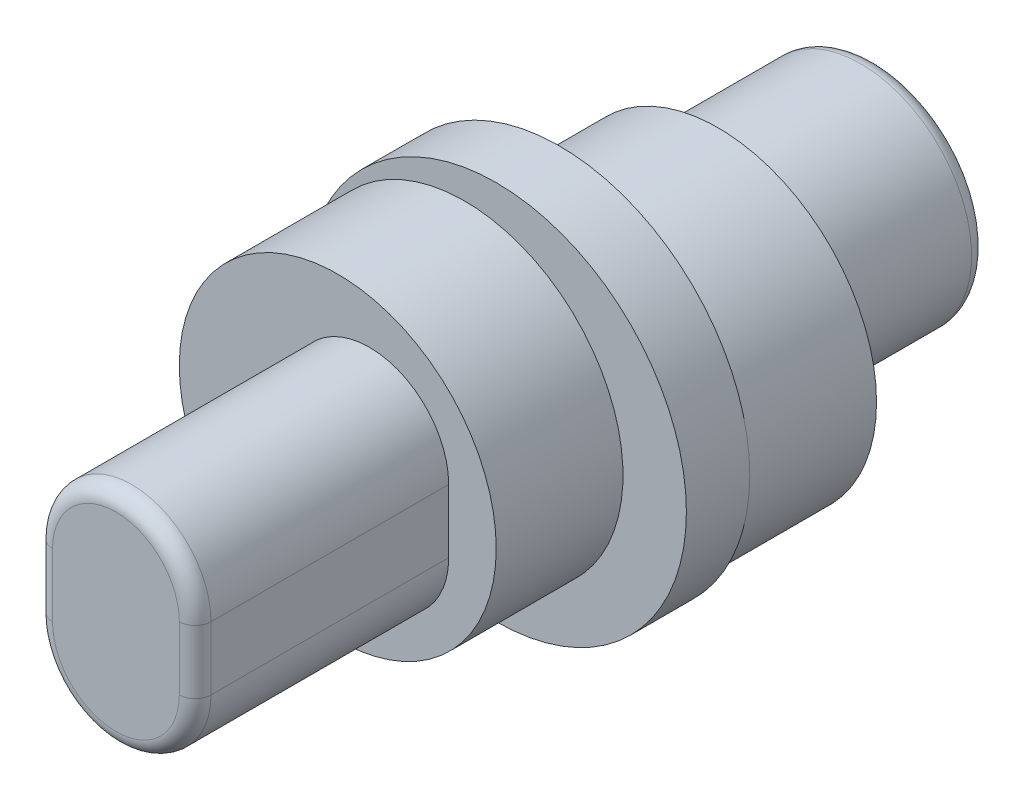
ISO-10303-21;
HEADER;
FILE_DESCRIPTION(('STEP AP214'),'2;1');
FILE_NAME('part.step','',(''),(''),'','','');
FILE_SCHEMA(('AUTOMOTIVE_DESIGN { 1 0 10303 214 1 1 1 1 }'));
ENDSEC;
DATA;
#1=APPLICATION_CONTEXT('core data for automotive mechanical design processes');
#2=APPLICATION_PROTOCOL_DEFINITION('international standard','automotive_design',2000,#1);
#3=PRODUCT_CONTEXT('',#1,'mechanical');
#4=PRODUCT('Part','Part','',(#3));
#5=PRODUCT_RELATED_PRODUCT_CATEGORY('part','',(#4));
#6=PRODUCT_DEFINITION_FORMATION('','',#4);
#7=PRODUCT_DEFINITION_CONTEXT('part definition',#1,'design');
#8=PRODUCT_DEFINITION('design','',#6,#7);
#9=PRODUCT_DEFINITION_SHAPE('','',#8);
#10=(LENGTH_UNIT() NAMED_UNIT(*) SI_UNIT(.MILLI.,.METRE.));
#11=(NAMED_UNIT(*) PLANE_ANGLE_UNIT() SI_UNIT($,.RADIAN.));
#12=(NAMED_UNIT(*) SI_UNIT($,.STERADIAN.) SOLID_ANGLE_UNIT());
#13=UNCERTAINTY_MEASURE_WITH_UNIT(LENGTH_MEASURE(1.E-05),#10,'distance_accuracy_value','');
#14=(GEOMETRIC_REPRESENTATION_CONTEXT(3) GLOBAL_UNCERTAINTY_ASSIGNED_CONTEXT((#13)) GLOBAL_UNIT_ASSIGNED_CONTEXT((#10,
#11,#12)) REPRESENTATION_CONTEXT('',''));
#15=CARTESIAN_POINT('',(0.,0.,0.));
#16=DIRECTION('',(0.,0.,1.));
#17=DIRECTION('',(1.,0.,0.));
#18=AXIS2_PLACEMENT_3D('',#15,#16,#17);
#19=CARTESIAN_POINT('',(0.,0.,12.));
#20=DIRECTION('',(0.,0.,1.));
#21=DIRECTION('',(1.,0.,0.));
#22=AXIS2_PLACEMENT_3D('',#19,#20,#21);
#23=PLANE('',#22);
#24=CARTESIAN_POINT('',(0.,1.,12.));
#25=DIRECTION('',(0.,0.,1.));
#26=DIRECTION('',(1.,0.,0.));
#27=AXIS2_PLACEMENT_3D('',#24,#25,#26);
#28=CIRCLE('',#27,2.);
#29=CARTESIAN_POINT('',(2.,1.,12.));
#30=VERTEX_POINT('',#29);
#31=CARTESIAN_POINT('',(-2.,0.999999999999999,12.));
#32=VERTEX_POINT('',#31);
#33=EDGE_CURVE('E216',#30,#32,#28,.T.);
#34=ORIENTED_EDGE('',*,*,#33,.T.);
#35=DIRECTION('',(0.,1.,0.));
#36=VECTOR('',#35,1.);
#37=CARTESIAN_POINT('',(-2.,-1.,12.));
#38=LINE('',#37,#36);
#39=CARTESIAN_POINT('',(-2.,-1.,12.));
#40=VERTEX_POINT('',#39);
#41=EDGE_CURVE('E224',#32,#40,#38,.F.);
#42=ORIENTED_EDGE('',*,*,#41,.T.);
#43=CARTESIAN_POINT('',(0.,-1.,12.));
#44=DIRECTION('',(0.,0.,1.));
#45=DIRECTION('',(1.,0.,0.));
#46=AXIS2_PLACEMENT_3D('',#43,#44,#45);
#47=CIRCLE('',#46,2.);
#48=CARTESIAN_POINT('',(2.,-1.,12.));
#49=VERTEX_POINT('',#48);
#50=EDGE_CURVE('E213',#40,#49,#47,.T.);
#51=ORIENTED_EDGE('',*,*,#50,.T.);
#52=DIRECTION('',(0.,1.,0.));
#53=VECTOR('',#52,1.);
#54=CARTESIAN_POINT('',(2.,0.,12.));
#55=LINE('',#54,#53);
#56=EDGE_CURVE('E219',#49,#30,#55,.T.);
#57=ORIENTED_EDGE('',*,*,#56,.T.);
#58=EDGE_LOOP('',(#34,#42,#51,#57));
#59=FACE_BOUND('',#58,.T.);
#60=ADVANCED_FACE('F74',(#59),#23,.T.);
#61=CARTESIAN_POINT('',(-1.,0.,4.));
#62=DIRECTION('',(0.,0.,-1.));
#63=DIRECTION('',(-1.,0.,0.));
#64=AXIS2_PLACEMENT_3D('',#61,#62,#63);
#65=CYLINDRICAL_SURFACE('',#64,5.);
#66=CARTESIAN_POINT('',(-1.,0.,4.));
#67=DIRECTION('',(0.,0.,1.));
#68=DIRECTION('',(1.,0.,0.));
#69=AXIS2_PLACEMENT_3D('',#66,#67,#68);
#70=CIRCLE('',#69,5.);
#71=CARTESIAN_POINT('',(4.,0.,4.));
#72=VERTEX_POINT('',#71);
#73=EDGE_CURVE('E186',#72,#72,#70,.T.);
#74=ORIENTED_EDGE('',*,*,#73,.F.);
#75=EDGE_LOOP('',(#74));
#76=FACE_BOUND('',#75,.T.);
#77=CARTESIAN_POINT('',(-1.,0.,0.));
#78=DIRECTION('',(0.,0.,1.));
#79=DIRECTION('',(1.,0.,0.));
#80=AXIS2_PLACEMENT_3D('',#77,#78,#79);
#81=CIRCLE('',#80,5.);
#82=CARTESIAN_POINT('',(-6.,0.,0.));
#83=VERTEX_POINT('',#82);
#84=EDGE_CURVE('E202',#83,#83,#81,.T.);
#85=ORIENTED_EDGE('',*,*,#84,.T.);
#86=EDGE_LOOP('',(#85));
#87=FACE_BOUND('',#86,.T.);
#88=ADVANCED_FACE('F270',(#76,#87),#65,.T.);
#89=CARTESIAN_POINT('',(-1.,0.,4.));
#90=DIRECTION('',(0.,0.,1.));
#91=DIRECTION('',(1.,0.,0.));
#92=AXIS2_PLACEMENT_3D('',#89,#90,#91);
#93=PLANE('',#92);
#94=CARTESIAN_POINT('',(0.,-1.,4.));
#95=DIRECTION('',(0.,0.,1.));
#96=DIRECTION('',(1.,0.,0.));
#97=AXIS2_PLACEMENT_3D('',#94,#95,#96);
#98=CIRCLE('',#97,2.5);
#99=CARTESIAN_POINT('',(-2.5,-1.,4.));
#100=VERTEX_POINT('',#99);
#101=CARTESIAN_POINT('',(2.5,-1.,4.));
#102=VERTEX_POINT('',#101);
#103=EDGE_CURVE('E139',#100,#102,#98,.T.);
#104=ORIENTED_EDGE('',*,*,#103,.F.);
#105=DIRECTION('',(0.,1.,0.));
#106=VECTOR('',#105,1.);
#107=CARTESIAN_POINT('',(-2.5,0.,4.));
#108=LINE('',#107,#106);
#109=CARTESIAN_POINT('',(-2.5,0.999999999999999,4.));
#110=VERTEX_POINT('',#109);
#111=EDGE_CURVE('E144',#100,#110,#108,.T.);
#112=ORIENTED_EDGE('',*,*,#111,.T.);
#113=CARTESIAN_POINT('',(0.,1.,4.));
#114=DIRECTION('',(0.,0.,1.));
#115=DIRECTION('',(1.,0.,0.));
#116=AXIS2_PLACEMENT_3D('',#113,#114,#115);
#117=CIRCLE('',#116,2.5);
#118=CARTESIAN_POINT('',(2.5,1.,4.));
#119=VERTEX_POINT('',#118);
#120=EDGE_CURVE('E173',#119,#110,#117,.T.);
#121=ORIENTED_EDGE('',*,*,#120,.F.);
#122=DIRECTION('',(0.,1.,0.));
#123=VECTOR('',#122,1.);
#124=CARTESIAN_POINT('',(2.5,0.,4.));
#125=LINE('',#124,#123);
#126=EDGE_CURVE('E143',#102,#119,#125,.T.);
#127=ORIENTED_EDGE('',*,*,#126,.F.);
#128=EDGE_LOOP('',(#104,#112,#121,#127));
#129=FACE_BOUND('',#128,.T.);
#130=ORIENTED_EDGE('',*,*,#73,.T.);
#131=EDGE_LOOP('',(#130));
#132=FACE_BOUND('',#131,.T.);
#133=ADVANCED_FACE('F140',(#129,#132),#93,.T.);
#134=CARTESIAN_POINT('',(0.,0.,0.));
#135=DIRECTION('',(0.,0.,-1.));
#136=DIRECTION('',(-1.,0.,0.));
#137=AXIS2_PLACEMENT_3D('',#134,#135,#136);
#138=PLANE('',#137);
#139=CARTESIAN_POINT('',(0.,0.,0.));
#140=DIRECTION('',(0.,0.,-1.));
#141=DIRECTION('',(-1.,0.,0.));
#142=AXIS2_PLACEMENT_3D('',#139,#140,#141);
#143=CIRCLE('',#142,6.);
#144=EDGE_CURVE('E193',#83,#83,#143,.T.);
#145=ORIENTED_EDGE('',*,*,#144,.F.);
#146=ORIENTED_EDGE('',*,*,#84,.F.);
#147=EDGE_LOOP('',(#145,#146));
#148=FACE_BOUND('',#147,.T.);
#149=ADVANCED_FACE('F295',(#148),#138,.F.);
#150=CARTESIAN_POINT('',(0.,0.,-2.));
#151=DIRECTION('',(0.,0.,1.));
#152=DIRECTION('',(1.,0.,0.));
#153=AXIS2_PLACEMENT_3D('',#150,#151,#152);
#154=CYLINDRICAL_SURFACE('',#153,6.);
#155=CARTESIAN_POINT('',(0.,0.,-2.));
#156=DIRECTION('',(0.,0.,-1.));
#157=DIRECTION('',(-1.,0.,0.));
#158=AXIS2_PLACEMENT_3D('',#155,#156,#157);
#159=CIRCLE('',#158,6.);
#160=CARTESIAN_POINT('',(6.,0.,-2.));
#161=VERTEX_POINT('',#160);
#162=EDGE_CURVE('E197',#161,#161,#159,.T.);
#163=ORIENTED_EDGE('',*,*,#162,.F.);
#164=EDGE_LOOP('',(#163));
#165=FACE_BOUND('',#164,.T.);
#166=ORIENTED_EDGE('',*,*,#144,.T.);
#167=EDGE_LOOP('',(#166));
#168=FACE_BOUND('',#167,.T.);
#169=ADVANCED_FACE('F292',(#165,#168),#154,.T.);
#170=CARTESIAN_POINT('',(0.,0.,-2.));
#171=DIRECTION('',(0.,0.,-1.));
#172=DIRECTION('',(-1.,0.,0.));
#173=AXIS2_PLACEMENT_3D('',#170,#171,#172);
#174=PLANE('',#173);
#175=ORIENTED_EDGE('',*,*,#162,.T.);
#176=CARTESIAN_POINT('',(1.,0.,-2.));
#177=DIRECTION('',(0.,0.,-1.));
#178=DIRECTION('',(-1.,0.,0.));
#179=AXIS2_PLACEMENT_3D('',#176,#177,#178);
#180=CIRCLE('',#179,5.);
#181=EDGE_CURVE('E185',#161,#161,#180,.T.);
#182=ORIENTED_EDGE('',*,*,#181,.F.);
#183=EDGE_LOOP('',(#175,#182));
#184=FACE_BOUND('',#183,.T.);
#185=ADVANCED_FACE('F289',(#184),#174,.T.);
#186=CARTESIAN_POINT('',(1.,0.,-6.));
#187=DIRECTION('',(0.,0.,1.));
#188=DIRECTION('',(1.,0.,0.));
#189=AXIS2_PLACEMENT_3D('',#186,#187,#188);
#190=CYLINDRICAL_SURFACE('',#189,5.);
#191=CARTESIAN_POINT('',(1.,0.,-6.));
#192=DIRECTION('',(0.,0.,-1.));
#193=DIRECTION('',(-1.,0.,0.));
#194=AXIS2_PLACEMENT_3D('',#191,#192,#193);
#195=CIRCLE('',#194,5.);
#196=CARTESIAN_POINT('',(-4.,0.,-6.));
#197=VERTEX_POINT('',#196);
#198=EDGE_CURVE('E188',#197,#197,#195,.T.);
#199=ORIENTED_EDGE('',*,*,#198,.F.);
#200=EDGE_LOOP('',(#199));
#201=FACE_BOUND('',#200,.T.);
#202=ORIENTED_EDGE('',*,*,#181,.T.);
#203=EDGE_LOOP('',(#202));
#204=FACE_BOUND('',#203,.T.);
#205=ADVANCED_FACE('F285',(#201,#204),#190,.T.);
#206=CARTESIAN_POINT('',(1.,0.,-6.));
#207=DIRECTION('',(0.,0.,-1.));
#208=DIRECTION('',(-1.,0.,0.));
#209=AXIS2_PLACEMENT_3D('',#206,#207,#208);
#210=PLANE('',#209);
#211=CARTESIAN_POINT('',(0.,0.,-6.));
#212=DIRECTION('',(0.,0.,-1.));
#213=DIRECTION('',(-1.,0.,0.));
#214=AXIS2_PLACEMENT_3D('',#211,#212,#213);
#215=CIRCLE('',#214,3.5);
#216=CARTESIAN_POINT('',(-3.5,0.,-6.));
#217=VERTEX_POINT('',#216);
#218=EDGE_CURVE('E184',#217,#217,#215,.T.);
#219=ORIENTED_EDGE('',*,*,#218,.F.);
#220=EDGE_LOOP('',(#219));
#221=FACE_BOUND('',#220,.T.);
#222=ORIENTED_EDGE('',*,*,#198,.T.);
#223=EDGE_LOOP('',(#222));
#224=FACE_BOUND('',#223,.T.);
#225=ADVANCED_FACE('F283',(#221,#224),#210,.T.);
#226=CARTESIAN_POINT('',(0.,0.,-12.));
#227=DIRECTION('',(0.,0.,1.));
#228=DIRECTION('',(1.,0.,0.));
#229=AXIS2_PLACEMENT_3D('',#226,#227,#228);
#230=CYLINDRICAL_SURFACE('',#229,3.5);
#231=CARTESIAN_POINT('',(0.,0.,-11.5));
#232=DIRECTION('',(0.,0.,-1.));
#233=DIRECTION('',(-1.,0.,0.));
#234=AXIS2_PLACEMENT_3D('',#231,#232,#233);
#235=CIRCLE('',#234,3.5);
#236=CARTESIAN_POINT('',(-3.5,0.,-11.5));
#237=VERTEX_POINT('',#236);
#238=EDGE_CURVE('E12',#237,#237,#235,.F.);
#239=ORIENTED_EDGE('',*,*,#238,.T.);
#240=EDGE_LOOP('',(#239));
#241=FACE_BOUND('',#240,.T.);
#242=ORIENTED_EDGE('',*,*,#218,.T.);
#243=EDGE_LOOP('',(#242));
#244=FACE_BOUND('',#243,.T.);
#245=ADVANCED_FACE('F278',(#241,#244),#230,.T.);
#246=CARTESIAN_POINT('',(0.,0.,-12.));
#247=DIRECTION('',(0.,0.,-1.));
#248=DIRECTION('',(-1.,0.,0.));
#249=AXIS2_PLACEMENT_3D('',#246,#247,#248);
#250=PLANE('',#249);
#251=CARTESIAN_POINT('',(0.,0.,-12.));
#252=DIRECTION('',(0.,0.,-1.));
#253=DIRECTION('',(-1.,0.,0.));
#254=AXIS2_PLACEMENT_3D('',#251,#252,#253);
#255=CIRCLE('',#254,3.);
#256=CARTESIAN_POINT('',(-3.,0.,-12.));
#257=VERTEX_POINT('',#256);
#258=EDGE_CURVE('E84',#257,#257,#255,.T.);
#259=ORIENTED_EDGE('',*,*,#258,.T.);
#260=EDGE_LOOP('',(#259));
#261=FACE_BOUND('',#260,.T.);
#262=ADVANCED_FACE('F373',(#261),#250,.T.);
#263=CARTESIAN_POINT('',(0.,1.,4.));
#264=DIRECTION('',(0.,0.,1.));
#265=DIRECTION('',(1.,0.,0.));
#266=AXIS2_PLACEMENT_3D('',#263,#264,#265);
#267=CYLINDRICAL_SURFACE('',#266,2.5);
#268=DIRECTION('',(0.,0.,1.));
#269=VECTOR('',#268,1.);
#270=CARTESIAN_POINT('',(-2.5,0.999999999999999,4.));
#271=LINE('',#270,#269);
#272=CARTESIAN_POINT('',(-2.5,0.999999999999999,11.5));
#273=VERTEX_POINT('',#272);
#274=EDGE_CURVE('E158',#110,#273,#271,.T.);
#275=ORIENTED_EDGE('',*,*,#274,.T.);
#276=CARTESIAN_POINT('',(0.,1.,11.5));
#277=DIRECTION('',(0.,0.,1.));
#278=DIRECTION('',(1.,0.,0.));
#279=AXIS2_PLACEMENT_3D('',#276,#277,#278);
#280=CIRCLE('',#279,2.5);
#281=CARTESIAN_POINT('',(2.5,1.,11.5));
#282=VERTEX_POINT('',#281);
#283=EDGE_CURVE('E100',#273,#282,#280,.F.);
#284=ORIENTED_EDGE('',*,*,#283,.T.);
#285=DIRECTION('',(0.,0.,1.));
#286=VECTOR('',#285,1.);
#287=CARTESIAN_POINT('',(2.5,1.,4.));
#288=LINE('',#287,#286);
#289=EDGE_CURVE('E149',#119,#282,#288,.T.);
#290=ORIENTED_EDGE('',*,*,#289,.F.);
#291=ORIENTED_EDGE('',*,*,#120,.T.);
#292=EDGE_LOOP('',(#275,#284,#290,#291));
#293=FACE_BOUND('',#292,.T.);
#294=ADVANCED_FACE('F258',(#293),#267,.T.);
#295=CARTESIAN_POINT('',(0.,-1.,4.));
#296=DIRECTION('',(0.,0.,1.));
#297=DIRECTION('',(1.,0.,0.));
#298=AXIS2_PLACEMENT_3D('',#295,#296,#297);
#299=CYLINDRICAL_SURFACE('',#298,2.5);
#300=DIRECTION('',(0.,0.,1.));
#301=VECTOR('',#300,1.);
#302=CARTESIAN_POINT('',(2.5,-1.,4.));
#303=LINE('',#302,#301);
#304=CARTESIAN_POINT('',(2.5,-1.,11.5));
#305=VERTEX_POINT('',#304);
#306=EDGE_CURVE('E177',#102,#305,#303,.T.);
#307=ORIENTED_EDGE('',*,*,#306,.T.);
#308=CARTESIAN_POINT('',(0.,-1.,11.5));
#309=DIRECTION('',(0.,0.,1.));
#310=DIRECTION('',(1.,0.,0.));
#311=AXIS2_PLACEMENT_3D('',#308,#309,#310);
#312=CIRCLE('',#311,2.5);
#313=CARTESIAN_POINT('',(-2.5,-1.,11.5));
#314=VERTEX_POINT('',#313);
#315=EDGE_CURVE('E155',#305,#314,#312,.F.);
#316=ORIENTED_EDGE('',*,*,#315,.T.);
#317=DIRECTION('',(0.,0.,1.));
#318=VECTOR('',#317,1.);
#319=CARTESIAN_POINT('',(-2.5,-1.,4.));
#320=LINE('',#319,#318);
#321=EDGE_CURVE('E153',#100,#314,#320,.T.);
#322=ORIENTED_EDGE('',*,*,#321,.F.);
#323=ORIENTED_EDGE('',*,*,#103,.T.);
#324=EDGE_LOOP('',(#307,#316,#322,#323));
#325=FACE_BOUND('',#324,.T.);
#326=ADVANCED_FACE('F154',(#325),#299,.T.);
#327=CARTESIAN_POINT('',(2.5,0.,4.));
#328=DIRECTION('',(1.,0.,0.));
#329=DIRECTION('',(0.,1.,0.));
#330=AXIS2_PLACEMENT_3D('',#327,#328,#329);
#331=PLANE('',#330);
#332=ORIENTED_EDGE('',*,*,#289,.T.);
#333=DIRECTION('',(0.,1.,0.));
#334=VECTOR('',#333,1.);
#335=CARTESIAN_POINT('',(2.5,0.,11.5));
#336=LINE('',#335,#334);
#337=EDGE_CURVE('E91',#282,#305,#336,.F.);
#338=ORIENTED_EDGE('',*,*,#337,.T.);
#339=ORIENTED_EDGE('',*,*,#306,.F.);
#340=ORIENTED_EDGE('',*,*,#126,.T.);
#341=EDGE_LOOP('',(#332,#338,#339,#340));
#342=FACE_BOUND('',#341,.T.);
#343=ADVANCED_FACE('F260',(#342),#331,.T.);
#344=CARTESIAN_POINT('',(-2.5,0.,4.));
#345=DIRECTION('',(1.,0.,0.));
#346=DIRECTION('',(0.,1.,0.));
#347=AXIS2_PLACEMENT_3D('',#344,#345,#346);
#348=PLANE('',#347);
#349=ORIENTED_EDGE('',*,*,#321,.T.);
#350=DIRECTION('',(0.,1.,0.));
#351=VECTOR('',#350,1.);
#352=CARTESIAN_POINT('',(-2.5,0.999999999999999,11.5));
#353=LINE('',#352,#351);
#354=EDGE_CURVE('E189',#314,#273,#353,.T.);
#355=ORIENTED_EDGE('',*,*,#354,.T.);
#356=ORIENTED_EDGE('',*,*,#274,.F.);
#357=ORIENTED_EDGE('',*,*,#111,.F.);
#358=EDGE_LOOP('',(#349,#355,#356,#357));
#359=FACE_BOUND('',#358,.T.);
#360=ADVANCED_FACE('F162',(#359),#348,.F.);
#361=CARTESIAN_POINT('',(2.,0.,11.5));
#362=DIRECTION('',(0.,1.,0.));
#363=DIRECTION('',(-1.,0.,0.));
#364=AXIS2_PLACEMENT_3D('',#361,#362,#363);
#365=CYLINDRICAL_SURFACE('',#364,0.5);
#366=CARTESIAN_POINT('',(2.,1.,11.5));
#367=DIRECTION('',(0.,1.,0.));
#368=DIRECTION('',(-1.,0.,0.));
#369=AXIS2_PLACEMENT_3D('',#366,#367,#368);
#370=CIRCLE('',#369,0.5);
#371=EDGE_CURVE('E167',#30,#282,#370,.T.);
#372=ORIENTED_EDGE('',*,*,#371,.F.);
#373=ORIENTED_EDGE('',*,*,#56,.F.);
#374=CARTESIAN_POINT('',(2.,-1.,11.5));
#375=DIRECTION('',(0.,-1.,0.));
#376=DIRECTION('',(0.,0.,-1.));
#377=AXIS2_PLACEMENT_3D('',#374,#375,#376);
#378=CIRCLE('',#377,0.5);
#379=EDGE_CURVE('E80',#305,#49,#378,.T.);
#380=ORIENTED_EDGE('',*,*,#379,.F.);
#381=ORIENTED_EDGE('',*,*,#337,.F.);
#382=EDGE_LOOP('',(#372,#373,#380,#381));
#383=FACE_BOUND('',#382,.T.);
#384=ADVANCED_FACE('F249',(#383),#365,.T.);
#385=CARTESIAN_POINT('',(0.,-1.,11.5));
#386=DIRECTION('',(0.,0.,1.));
#387=DIRECTION('',(1.,0.,0.));
#388=AXIS2_PLACEMENT_3D('',#385,#386,#387);
#389=TOROIDAL_SURFACE('',#388,2.,0.5);
#390=ORIENTED_EDGE('',*,*,#379,.T.);
#391=ORIENTED_EDGE('',*,*,#50,.F.);
#392=CARTESIAN_POINT('',(-2.,-1.,11.5));
#393=DIRECTION('',(0.,1.,0.));
#394=DIRECTION('',(0.,0.,1.));
#395=AXIS2_PLACEMENT_3D('',#392,#393,#394);
#396=CIRCLE('',#395,0.5);
#397=EDGE_CURVE('E237',#314,#40,#396,.T.);
#398=ORIENTED_EDGE('',*,*,#397,.F.);
#399=ORIENTED_EDGE('',*,*,#315,.F.);
#400=EDGE_LOOP('',(#390,#391,#398,#399));
#401=FACE_BOUND('',#400,.T.);
#402=ADVANCED_FACE('F251',(#401),#389,.T.);
#403=CARTESIAN_POINT('',(0.,1.,11.5));
#404=DIRECTION('',(0.,0.,1.));
#405=DIRECTION('',(1.,0.,0.));
#406=AXIS2_PLACEMENT_3D('',#403,#404,#405);
#407=TOROIDAL_SURFACE('',#406,2.,0.5);
#408=ORIENTED_EDGE('',*,*,#371,.T.);
#409=ORIENTED_EDGE('',*,*,#283,.F.);
#410=CARTESIAN_POINT('',(-2.,0.999999999999999,11.5));
#411=DIRECTION('',(0.,-1.,0.));
#412=DIRECTION('',(1.,0.,0.));
#413=AXIS2_PLACEMENT_3D('',#410,#411,#412);
#414=CIRCLE('',#413,0.5);
#415=EDGE_CURVE('E236',#32,#273,#414,.T.);
#416=ORIENTED_EDGE('',*,*,#415,.F.);
#417=ORIENTED_EDGE('',*,*,#33,.F.);
#418=EDGE_LOOP('',(#408,#409,#416,#417));
#419=FACE_BOUND('',#418,.T.);
#420=ADVANCED_FACE('F246',(#419),#407,.T.);
#421=CARTESIAN_POINT('',(-2.,0.,11.5));
#422=DIRECTION('',(0.,-1.,0.));
#423=DIRECTION('',(1.,0.,0.));
#424=AXIS2_PLACEMENT_3D('',#421,#422,#423);
#425=CYLINDRICAL_SURFACE('',#424,0.5);
#426=ORIENTED_EDGE('',*,*,#397,.T.);
#427=ORIENTED_EDGE('',*,*,#41,.F.);
#428=ORIENTED_EDGE('',*,*,#415,.T.);
#429=ORIENTED_EDGE('',*,*,#354,.F.);
#430=EDGE_LOOP('',(#426,#427,#428,#429));
#431=FACE_BOUND('',#430,.T.);
#432=ADVANCED_FACE('F259',(#431),#425,.T.);
#433=CARTESIAN_POINT('',(0.,0.,-11.5));
#434=DIRECTION('',(0.,0.,-1.));
#435=DIRECTION('',(-1.,0.,0.));
#436=AXIS2_PLACEMENT_3D('',#433,#434,#435);
#437=TOROIDAL_SURFACE('',#436,3.,0.5);
#438=ORIENTED_EDGE('',*,*,#238,.F.);
#439=EDGE_LOOP('',(#438));
#440=FACE_BOUND('',#439,.T.);
#441=ORIENTED_EDGE('',*,*,#258,.F.);
#442=EDGE_LOOP('',(#441));
#443=FACE_BOUND('',#442,.T.);
#444=ADVANCED_FACE('F75',(#440,#443),#437,.T.);
#445=CLOSED_SHELL('',(#60,#88,#133,#149,#169,#185,#205,#225,#245,#262,#294,#326,#343,#360,#384,
#402,#420,#432,#444));
#446=MANIFOLD_SOLID_BREP('B2',#445);
#447=ADVANCED_BREP_SHAPE_REPRESENTATION('',(#18,#446),#14);
#448=SHAPE_DEFINITION_REPRESENTATION(#9,#447);
ENDSEC;
END-ISO-10303-21;
